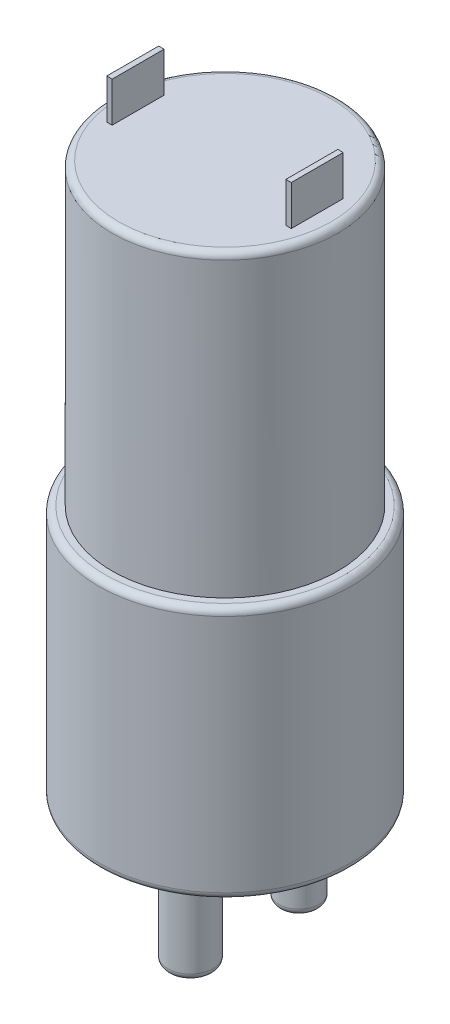
ISO-10303-21;
HEADER;
FILE_DESCRIPTION(('STEP AP214'),'2;1');
FILE_NAME('part.step','',(''),(''),'','','');
FILE_SCHEMA(('AUTOMOTIVE_DESIGN { 1 0 10303 214 1 1 1 1 }'));
ENDSEC;
DATA;
#1=APPLICATION_CONTEXT('core data for automotive mechanical design processes');
#2=APPLICATION_PROTOCOL_DEFINITION('international standard','automotive_design',2000,#1);
#3=PRODUCT_CONTEXT('',#1,'mechanical');
#4=PRODUCT('Part','Part','',(#3));
#5=PRODUCT_RELATED_PRODUCT_CATEGORY('part','',(#4));
#6=PRODUCT_DEFINITION_FORMATION('','',#4);
#7=PRODUCT_DEFINITION_CONTEXT('part definition',#1,'design');
#8=PRODUCT_DEFINITION('design','',#6,#7);
#9=PRODUCT_DEFINITION_SHAPE('','',#8);
#10=(LENGTH_UNIT() NAMED_UNIT(*) SI_UNIT(.MILLI.,.METRE.));
#11=(NAMED_UNIT(*) PLANE_ANGLE_UNIT() SI_UNIT($,.RADIAN.));
#12=(NAMED_UNIT(*) SI_UNIT($,.STERADIAN.) SOLID_ANGLE_UNIT());
#13=UNCERTAINTY_MEASURE_WITH_UNIT(LENGTH_MEASURE(1.E-05),#10,'distance_accuracy_value','');
#14=(GEOMETRIC_REPRESENTATION_CONTEXT(3) GLOBAL_UNCERTAINTY_ASSIGNED_CONTEXT((#13)) GLOBAL_UNIT_ASSIGNED_CONTEXT((#10,
#11,#12)) REPRESENTATION_CONTEXT('',''));
#15=CARTESIAN_POINT('',(0.,0.,0.));
#16=DIRECTION('',(0.,0.,1.));
#17=DIRECTION('',(1.,0.,0.));
#18=AXIS2_PLACEMENT_3D('',#15,#16,#17);
#19=CARTESIAN_POINT('',(0.,22.5,0.));
#20=DIRECTION('',(0.,1.,0.));
#21=DIRECTION('',(0.,0.,1.));
#22=AXIS2_PLACEMENT_3D('',#19,#20,#21);
#23=PLANE('',#22);
#24=CARTESIAN_POINT('',(0.,22.5,0.));
#25=DIRECTION('',(0.,1.,0.));
#26=DIRECTION('',(0.,0.,1.));
#27=AXIS2_PLACEMENT_3D('',#24,#25,#26);
#28=CIRCLE('',#27,8.);
#29=CARTESIAN_POINT('',(0.,22.5,8.));
#30=VERTEX_POINT('',#29);
#31=EDGE_CURVE('E48',#30,#30,#28,.T.);
#32=ORIENTED_EDGE('',*,*,#31,.T.);
#33=EDGE_LOOP('',(#32));
#34=FACE_BOUND('',#33,.T.);
#35=DIRECTION('',(-1.,0.,0.));
#36=VECTOR('',#35,1.);
#37=CARTESIAN_POINT('',(-6.93882099547602,22.5,-1.95345107203532));
#38=LINE('',#37,#36);
#39=CARTESIAN_POINT('',(-6.53185202211751,22.5,-1.95345107203532));
#40=VERTEX_POINT('',#39);
#41=CARTESIAN_POINT('',(-6.93882099547602,22.5,-1.95345107203532));
#42=VERTEX_POINT('',#41);
#43=EDGE_CURVE('E130',#40,#42,#38,.T.);
#44=ORIENTED_EDGE('',*,*,#43,.F.);
#45=DIRECTION('',(0.,0.,-1.));
#46=VECTOR('',#45,1.);
#47=CARTESIAN_POINT('',(-6.53185202211751,22.5,1.95345107203532));
#48=LINE('',#47,#46);
#49=CARTESIAN_POINT('',(-6.53185202211751,22.5,1.95345107203532));
#50=VERTEX_POINT('',#49);
#51=EDGE_CURVE('E127',#50,#40,#48,.T.);
#52=ORIENTED_EDGE('',*,*,#51,.F.);
#53=DIRECTION('',(1.,0.,0.));
#54=VECTOR('',#53,1.);
#55=CARTESIAN_POINT('',(-6.93882099547602,22.5,1.95345107203532));
#56=LINE('',#55,#54);
#57=CARTESIAN_POINT('',(-6.93882099547602,22.5,1.95345107203532));
#58=VERTEX_POINT('',#57);
#59=EDGE_CURVE('E145',#58,#50,#56,.T.);
#60=ORIENTED_EDGE('',*,*,#59,.F.);
#61=DIRECTION('',(0.,0.,1.));
#62=VECTOR('',#61,1.);
#63=CARTESIAN_POINT('',(-6.93882099547602,22.5,1.95345107203532));
#64=LINE('',#63,#62);
#65=EDGE_CURVE('E153',#42,#58,#64,.T.);
#66=ORIENTED_EDGE('',*,*,#65,.F.);
#67=EDGE_LOOP('',(#44,#52,#60,#66));
#68=FACE_BOUND('',#67,.T.);
#69=DIRECTION('',(-1.,0.,0.));
#70=VECTOR('',#69,1.);
#71=CARTESIAN_POINT('',(6.93882099547602,22.5,-1.95345107203532));
#72=LINE('',#71,#70);
#73=CARTESIAN_POINT('',(6.93882099547602,22.5,-1.95345107203532));
#74=VERTEX_POINT('',#73);
#75=CARTESIAN_POINT('',(6.53185202211751,22.5,-1.95345107203532));
#76=VERTEX_POINT('',#75);
#77=EDGE_CURVE('E126',#74,#76,#72,.T.);
#78=ORIENTED_EDGE('',*,*,#77,.F.);
#79=DIRECTION('',(0.,0.,-1.));
#80=VECTOR('',#79,1.);
#81=CARTESIAN_POINT('',(6.93882099547602,22.5,1.95345107203532));
#82=LINE('',#81,#80);
#83=CARTESIAN_POINT('',(6.93882099547602,22.5,1.95345107203532));
#84=VERTEX_POINT('',#83);
#85=EDGE_CURVE('E121',#84,#74,#82,.T.);
#86=ORIENTED_EDGE('',*,*,#85,.F.);
#87=DIRECTION('',(1.,0.,0.));
#88=VECTOR('',#87,1.);
#89=CARTESIAN_POINT('',(6.93882099547602,22.5,1.95345107203532));
#90=LINE('',#89,#88);
#91=CARTESIAN_POINT('',(6.53185202211751,22.5,1.95345107203532));
#92=VERTEX_POINT('',#91);
#93=EDGE_CURVE('E106',#92,#84,#90,.T.);
#94=ORIENTED_EDGE('',*,*,#93,.F.);
#95=DIRECTION('',(0.,0.,1.));
#96=VECTOR('',#95,1.);
#97=CARTESIAN_POINT('',(6.53185202211751,22.5,1.95345107203532));
#98=LINE('',#97,#96);
#99=EDGE_CURVE('E114',#76,#92,#98,.T.);
#100=ORIENTED_EDGE('',*,*,#99,.F.);
#101=EDGE_LOOP('',(#78,#86,#94,#100));
#102=FACE_BOUND('',#101,.T.);
#103=ADVANCED_FACE('F40',(#34,#68,#102),#23,.T.);
#104=CARTESIAN_POINT('',(0.,22.5,0.));
#105=DIRECTION('',(0.,-1.,0.));
#106=DIRECTION('',(0.,0.,-1.));
#107=AXIS2_PLACEMENT_3D('',#104,#105,#106);
#108=CYLINDRICAL_SURFACE('',#107,8.5);
#109=CARTESIAN_POINT('',(0.,22.,0.));
#110=DIRECTION('',(0.,1.,0.));
#111=DIRECTION('',(0.,0.,1.));
#112=AXIS2_PLACEMENT_3D('',#109,#110,#111);
#113=CIRCLE('',#112,8.5);
#114=CARTESIAN_POINT('',(0.,22.,-8.5));
#115=VERTEX_POINT('',#114);
#116=EDGE_CURVE('E11',#115,#115,#113,.F.);
#117=CARTESIAN_POINT('',(0.,0.,0.));
#118=DIRECTION('',(0.,1.,0.));
#119=DIRECTION('',(0.,0.,1.));
#120=AXIS2_PLACEMENT_3D('',#117,#118,#119);
#121=CIRCLE('',#120,8.5);
#122=CARTESIAN_POINT('',(0.,0.,-8.5));
#123=VERTEX_POINT('',#122);
#124=EDGE_CURVE('E171',#123,#123,#121,.T.);
#125=CARTESIAN_POINT('',(0.,22.,-8.5));
#126=CARTESIAN_POINT('',(0.,21.7708333333333,-8.5));
#127=CARTESIAN_POINT('',(0.,21.5416666666667,-8.5));
#128=CARTESIAN_POINT('',(0.,21.0833333333333,-8.5));
#129=CARTESIAN_POINT('',(0.,20.8541666666667,-8.5));
#130=CARTESIAN_POINT('',(0.,20.3958333333333,-8.5));
#131=CARTESIAN_POINT('',(0.,20.1666666666667,-8.5));
#132=CARTESIAN_POINT('',(0.,19.7083333333333,-8.5));
#133=CARTESIAN_POINT('',(0.,19.4791666666667,-8.5));
#134=CARTESIAN_POINT('',(0.,19.0208333333333,-8.5));
#135=CARTESIAN_POINT('',(0.,18.7916666666667,-8.5));
#136=CARTESIAN_POINT('',(0.,18.3333333333333,-8.5));
#137=CARTESIAN_POINT('',(0.,18.1041666666667,-8.5));
#138=CARTESIAN_POINT('',(0.,17.6458333333333,-8.5));
#139=CARTESIAN_POINT('',(0.,17.4166666666667,-8.5));
#140=CARTESIAN_POINT('',(0.,16.9583333333333,-8.5));
#141=CARTESIAN_POINT('',(0.,16.7291666666667,-8.5));
#142=CARTESIAN_POINT('',(0.,16.2708333333333,-8.5));
#143=CARTESIAN_POINT('',(0.,16.0416666666667,-8.5));
#144=CARTESIAN_POINT('',(0.,15.5833333333333,-8.5));
#145=CARTESIAN_POINT('',(0.,15.3541666666667,-8.5));
#146=CARTESIAN_POINT('',(0.,14.8958333333333,-8.5));
#147=CARTESIAN_POINT('',(0.,14.6666666666667,-8.5));
#148=CARTESIAN_POINT('',(0.,14.2083333333333,-8.5));
#149=CARTESIAN_POINT('',(0.,13.9791666666667,-8.5));
#150=CARTESIAN_POINT('',(0.,13.5208333333333,-8.5));
#151=CARTESIAN_POINT('',(0.,13.2916666666667,-8.5));
#152=CARTESIAN_POINT('',(0.,12.8333333333333,-8.5));
#153=CARTESIAN_POINT('',(0.,12.6041666666667,-8.5));
#154=CARTESIAN_POINT('',(0.,12.1458333333333,-8.5));
#155=CARTESIAN_POINT('',(0.,11.9166666666667,-8.5));
#156=CARTESIAN_POINT('',(0.,11.4583333333333,-8.5));
#157=CARTESIAN_POINT('',(0.,11.2291666666667,-8.5));
#158=CARTESIAN_POINT('',(0.,10.7708333333333,-8.5));
#159=CARTESIAN_POINT('',(0.,10.5416666666667,-8.5));
#160=CARTESIAN_POINT('',(0.,10.0833333333333,-8.5));
#161=CARTESIAN_POINT('',(0.,9.85416666666666,-8.5));
#162=CARTESIAN_POINT('',(0.,9.39583333333333,-8.5));
#163=CARTESIAN_POINT('',(0.,9.16666666666666,-8.5));
#164=CARTESIAN_POINT('',(0.,8.70833333333333,-8.5));
#165=CARTESIAN_POINT('',(0.,8.47916666666666,-8.5));
#166=CARTESIAN_POINT('',(0.,8.02083333333333,-8.5));
#167=CARTESIAN_POINT('',(0.,7.79166666666666,-8.5));
#168=CARTESIAN_POINT('',(0.,7.33333333333333,-8.5));
#169=CARTESIAN_POINT('',(0.,7.10416666666667,-8.5));
#170=CARTESIAN_POINT('',(0.,6.64583333333333,-8.5));
#171=CARTESIAN_POINT('',(0.,6.41666666666667,-8.5));
#172=CARTESIAN_POINT('',(0.,5.95833333333333,-8.5));
#173=CARTESIAN_POINT('',(0.,5.72916666666666,-8.5));
#174=CARTESIAN_POINT('',(0.,5.27083333333333,-8.5));
#175=CARTESIAN_POINT('',(0.,5.04166666666666,-8.5));
#176=CARTESIAN_POINT('',(0.,4.58333333333333,-8.5));
#177=CARTESIAN_POINT('',(0.,4.35416666666666,-8.5));
#178=CARTESIAN_POINT('',(0.,3.89583333333333,-8.5));
#179=CARTESIAN_POINT('',(0.,3.66666666666666,-8.5));
#180=CARTESIAN_POINT('',(0.,3.20833333333333,-8.5));
#181=CARTESIAN_POINT('',(0.,2.97916666666666,-8.5));
#182=CARTESIAN_POINT('',(0.,2.52083333333333,-8.5));
#183=CARTESIAN_POINT('',(0.,2.29166666666666,-8.5));
#184=CARTESIAN_POINT('',(0.,1.83333333333333,-8.5));
#185=CARTESIAN_POINT('',(0.,1.60416666666666,-8.5));
#186=CARTESIAN_POINT('',(0.,1.14583333333333,-8.5));
#187=CARTESIAN_POINT('',(0.,0.916666666666664,-8.5));
#188=CARTESIAN_POINT('',(0.,0.45833333333333,-8.5));
#189=CARTESIAN_POINT('',(0.,0.229166666666663,-8.5));
#190=CARTESIAN_POINT('',(0.,0.,-8.5));
#191=B_SPLINE_CURVE_WITH_KNOTS('',3,(#125,#126,#127,#128,#129,#130,#131,#132,#133,#134,#135,
#136,#137,#138,#139,#140,#141,#142,#143,#144,#145,#146,#147,#148,#149,#150,#151,#152,#153,#154,
#155,#156,#157,#158,#159,#160,#161,#162,#163,#164,#165,#166,#167,#168,#169,#170,#171,#172,#173,
#174,#175,#176,#177,#178,#179,#180,#181,#182,#183,#184,#185,#186,#187,#188,#189,#190),
.UNSPECIFIED.,.F.,.F.,(4,2,2,2,2,2,2,2,2,2,2,2,2,2,2,2,2,2,2,2,2,2,2,2,2,2,2,2,2,2,2,2,4),(0.,
0.687499999999997,1.375,2.0625,2.75,3.4375,4.125,4.8125,5.5,6.1875,6.875,7.5625,8.25,8.9375,
9.625,10.3125,11.,11.6875,12.375,13.0625,13.75,14.4375,15.125,15.8125,16.5,17.1875,17.875,
18.5625,19.25,19.9375,20.625,21.3125,22.),.UNSPECIFIED.);
#192=EDGE_CURVE('BSEAM229',#115,#123,#191,.T.);
#193=ORIENTED_EDGE('',*,*,#116,.T.);
#194=ORIENTED_EDGE('',*,*,#124,.T.);
#195=ORIENTED_EDGE('',*,*,#192,.T.);
#196=ORIENTED_EDGE('',*,*,#192,.F.);
#197=EDGE_LOOP('',(#193,#195,#194,#196));
#198=FACE_BOUND('',#197,.T.);
#199=ADVANCED_FACE('F229',(#198),#108,.T.);
#200=CARTESIAN_POINT('',(0.,-19.,0.));
#201=DIRECTION('',(0.,1.,0.));
#202=DIRECTION('',(0.,0.,1.));
#203=AXIS2_PLACEMENT_3D('',#200,#201,#202);
#204=CYLINDRICAL_SURFACE('',#203,9.5);
#205=CARTESIAN_POINT('',(0.,-18.5,0.));
#206=DIRECTION('',(0.,-1.,0.));
#207=DIRECTION('',(0.,0.,-1.));
#208=AXIS2_PLACEMENT_3D('',#205,#206,#207);
#209=CIRCLE('',#208,9.5);
#210=CARTESIAN_POINT('',(0.,-18.5,-9.5));
#211=VERTEX_POINT('',#210);
#212=EDGE_CURVE('E209',#211,#211,#209,.F.);
#213=ORIENTED_EDGE('',*,*,#212,.T.);
#214=EDGE_LOOP('',(#213));
#215=FACE_BOUND('',#214,.T.);
#216=CARTESIAN_POINT('',(0.,-0.5,0.));
#217=DIRECTION('',(0.,-1.,0.));
#218=DIRECTION('',(0.,0.,-1.));
#219=AXIS2_PLACEMENT_3D('',#216,#217,#218);
#220=CIRCLE('',#219,9.5);
#221=CARTESIAN_POINT('',(0.,-0.5,-9.5));
#222=VERTEX_POINT('',#221);
#223=EDGE_CURVE('E206',#222,#222,#220,.T.);
#224=ORIENTED_EDGE('',*,*,#223,.T.);
#225=EDGE_LOOP('',(#224));
#226=FACE_BOUND('',#225,.T.);
#227=ADVANCED_FACE('F234',(#215,#226),#204,.T.);
#228=CARTESIAN_POINT('',(0.,-19.,0.));
#229=DIRECTION('',(0.,-1.,0.));
#230=DIRECTION('',(0.,0.,-1.));
#231=AXIS2_PLACEMENT_3D('',#228,#229,#230);
#232=PLANE('',#231);
#233=CARTESIAN_POINT('',(0.,-19.,-5.56386529657235));
#234=DIRECTION('',(0.,-1.,0.));
#235=DIRECTION('',(0.,0.,-1.));
#236=AXIS2_PLACEMENT_3D('',#233,#234,#235);
#237=CIRCLE('',#236,2.);
#238=CARTESIAN_POINT('',(0.,-19.,-7.56386529657235));
#239=VERTEX_POINT('',#238);
#240=EDGE_CURVE('E191',#239,#239,#237,.F.);
#241=ORIENTED_EDGE('',*,*,#240,.T.);
#242=EDGE_LOOP('',(#241));
#243=FACE_BOUND('',#242,.T.);
#244=CARTESIAN_POINT('',(0.,-19.,2.6));
#245=DIRECTION('',(0.,-1.,0.));
#246=DIRECTION('',(0.,0.,-1.));
#247=AXIS2_PLACEMENT_3D('',#244,#245,#246);
#248=CIRCLE('',#247,2.2);
#249=CARTESIAN_POINT('',(0.,-19.,0.400000000000003));
#250=VERTEX_POINT('',#249);
#251=EDGE_CURVE('E188',#250,#250,#248,.F.);
#252=ORIENTED_EDGE('',*,*,#251,.T.);
#253=EDGE_LOOP('',(#252));
#254=FACE_BOUND('',#253,.T.);
#255=CARTESIAN_POINT('',(0.,-19.,0.));
#256=DIRECTION('',(0.,-1.,0.));
#257=DIRECTION('',(0.,0.,-1.));
#258=AXIS2_PLACEMENT_3D('',#255,#256,#257);
#259=CIRCLE('',#258,9.);
#260=CARTESIAN_POINT('',(0.,-19.,-9.));
#261=VERTEX_POINT('',#260);
#262=EDGE_CURVE('E185',#261,#261,#259,.T.);
#263=ORIENTED_EDGE('',*,*,#262,.T.);
#264=EDGE_LOOP('',(#263));
#265=FACE_BOUND('',#264,.T.);
#266=ADVANCED_FACE('F265',(#243,#254,#265),#232,.T.);
#267=CARTESIAN_POINT('',(0.,0.,0.));
#268=DIRECTION('',(0.,-1.,0.));
#269=DIRECTION('',(0.,0.,-1.));
#270=AXIS2_PLACEMENT_3D('',#267,#268,#269);
#271=PLANE('',#270);
#272=CARTESIAN_POINT('',(0.,0.,0.));
#273=DIRECTION('',(0.,-1.,0.));
#274=DIRECTION('',(0.,0.,-1.));
#275=AXIS2_PLACEMENT_3D('',#272,#273,#274);
#276=CIRCLE('',#275,9.);
#277=CARTESIAN_POINT('',(0.,0.,-9.));
#278=VERTEX_POINT('',#277);
#279=EDGE_CURVE('E212',#278,#278,#276,.F.);
#280=ORIENTED_EDGE('',*,*,#279,.T.);
#281=EDGE_LOOP('',(#280));
#282=FACE_BOUND('',#281,.T.);
#283=ORIENTED_EDGE('',*,*,#124,.F.);
#284=EDGE_LOOP('',(#283));
#285=FACE_BOUND('',#284,.T.);
#286=ADVANCED_FACE('F267',(#282,#285),#271,.F.);
#287=CARTESIAN_POINT('',(0.,-28.5,2.6));
#288=DIRECTION('',(0.,-1.,0.));
#289=DIRECTION('',(0.,0.,-1.));
#290=AXIS2_PLACEMENT_3D('',#287,#288,#289);
#291=PLANE('',#290);
#292=CARTESIAN_POINT('',(0.,-28.5,2.6));
#293=DIRECTION('',(0.,-1.,0.));
#294=DIRECTION('',(0.,0.,-1.));
#295=AXIS2_PLACEMENT_3D('',#292,#293,#294);
#296=CIRCLE('',#295,1.2);
#297=CARTESIAN_POINT('',(0.,-28.5,1.4));
#298=VERTEX_POINT('',#297);
#299=EDGE_CURVE('E200',#298,#298,#296,.T.);
#300=ORIENTED_EDGE('',*,*,#299,.T.);
#301=EDGE_LOOP('',(#300));
#302=FACE_BOUND('',#301,.T.);
#303=CARTESIAN_POINT('',(0.,-28.5,2.6));
#304=DIRECTION('',(0.,-1.,0.));
#305=DIRECTION('',(0.,0.,-1.));
#306=AXIS2_PLACEMENT_3D('',#303,#304,#305);
#307=CIRCLE('',#306,0.199999999999999);
#308=CARTESIAN_POINT('',(0.,-28.5,2.4));
#309=VERTEX_POINT('',#308);
#310=EDGE_CURVE('E168',#309,#309,#307,.T.);
#311=ORIENTED_EDGE('',*,*,#310,.F.);
#312=EDGE_LOOP('',(#311));
#313=FACE_BOUND('',#312,.T.);
#314=ADVANCED_FACE('F276',(#302,#313),#291,.T.);
#315=CARTESIAN_POINT('',(0.,-28.5,2.6));
#316=DIRECTION('',(0.,1.,0.));
#317=DIRECTION('',(0.,0.,1.));
#318=AXIS2_PLACEMENT_3D('',#315,#316,#317);
#319=CYLINDRICAL_SURFACE('',#318,1.7);
#320=CARTESIAN_POINT('',(0.,-19.5,2.6));
#321=DIRECTION('',(0.,-1.,0.));
#322=DIRECTION('',(0.,0.,-1.));
#323=AXIS2_PLACEMENT_3D('',#320,#321,#322);
#324=CIRCLE('',#323,1.7);
#325=CARTESIAN_POINT('',(0.,-19.5,0.900000000000003));
#326=VERTEX_POINT('',#325);
#327=EDGE_CURVE('E197',#326,#326,#324,.T.);
#328=ORIENTED_EDGE('',*,*,#327,.T.);
#329=EDGE_LOOP('',(#328));
#330=FACE_BOUND('',#329,.T.);
#331=CARTESIAN_POINT('',(0.,-28.,2.6));
#332=DIRECTION('',(0.,-1.,0.));
#333=DIRECTION('',(0.,0.,-1.));
#334=AXIS2_PLACEMENT_3D('',#331,#332,#333);
#335=CIRCLE('',#334,1.7);
#336=CARTESIAN_POINT('',(0.,-28.,0.900000000000003));
#337=VERTEX_POINT('',#336);
#338=EDGE_CURVE('E194',#337,#337,#335,.F.);
#339=ORIENTED_EDGE('',*,*,#338,.T.);
#340=EDGE_LOOP('',(#339));
#341=FACE_BOUND('',#340,.T.);
#342=ADVANCED_FACE('F296',(#330,#341),#319,.T.);
#343=CARTESIAN_POINT('',(0.,-28.5,2.6));
#344=DIRECTION('',(0.,1.,0.));
#345=DIRECTION('',(0.,0.,1.));
#346=AXIS2_PLACEMENT_3D('',#343,#344,#345);
#347=CYLINDRICAL_SURFACE('',#346,0.199999999999999);
#348=ORIENTED_EDGE('',*,*,#310,.T.);
#349=EDGE_LOOP('',(#348));
#350=FACE_BOUND('',#349,.T.);
#351=CARTESIAN_POINT('',(0.,-19.,2.6));
#352=DIRECTION('',(0.,-1.,0.));
#353=DIRECTION('',(0.,0.,-1.));
#354=AXIS2_PLACEMENT_3D('',#351,#352,#353);
#355=CIRCLE('',#354,0.199999999999999);
#356=CARTESIAN_POINT('',(0.,-19.,2.4));
#357=VERTEX_POINT('',#356);
#358=EDGE_CURVE('E167',#357,#357,#355,.T.);
#359=ORIENTED_EDGE('',*,*,#358,.F.);
#360=EDGE_LOOP('',(#359));
#361=FACE_BOUND('',#360,.T.);
#362=ADVANCED_FACE('F287',(#350,#361),#347,.F.);
#363=ORIENTED_EDGE('',*,*,#358,.T.);
#364=EDGE_LOOP('',(#363));
#365=FACE_BOUND('',#364,.T.);
#366=ADVANCED_FACE('F271',(#365),#232,.T.);
#367=CARTESIAN_POINT('',(0.,-28.5,-5.56386529657235));
#368=DIRECTION('',(0.,-1.,0.));
#369=DIRECTION('',(0.,0.,-1.));
#370=AXIS2_PLACEMENT_3D('',#367,#368,#369);
#371=PLANE('',#370);
#372=CARTESIAN_POINT('',(0.,-28.5,-5.56386529657235));
#373=DIRECTION('',(0.,-1.,0.));
#374=DIRECTION('',(0.,0.,-1.));
#375=AXIS2_PLACEMENT_3D('',#372,#373,#374);
#376=CIRCLE('',#375,1.);
#377=CARTESIAN_POINT('',(0.,-28.5,-6.56386529657235));
#378=VERTEX_POINT('',#377);
#379=EDGE_CURVE('E203',#378,#378,#376,.T.);
#380=ORIENTED_EDGE('',*,*,#379,.T.);
#381=EDGE_LOOP('',(#380));
#382=FACE_BOUND('',#381,.T.);
#383=CARTESIAN_POINT('',(0.,-28.5,-5.56386529657235));
#384=DIRECTION('',(0.,-1.,0.));
#385=DIRECTION('',(0.,0.,-1.));
#386=AXIS2_PLACEMENT_3D('',#383,#384,#385);
#387=CIRCLE('',#386,0.1);
#388=CARTESIAN_POINT('',(0.,-28.5,-5.66386529657235));
#389=VERTEX_POINT('',#388);
#390=EDGE_CURVE('E164',#389,#389,#387,.T.);
#391=ORIENTED_EDGE('',*,*,#390,.F.);
#392=EDGE_LOOP('',(#391));
#393=FACE_BOUND('',#392,.T.);
#394=ADVANCED_FACE('F286',(#382,#393),#371,.T.);
#395=CARTESIAN_POINT('',(0.,-28.5,-5.56386529657235));
#396=DIRECTION('',(0.,1.,0.));
#397=DIRECTION('',(0.,0.,1.));
#398=AXIS2_PLACEMENT_3D('',#395,#396,#397);
#399=CYLINDRICAL_SURFACE('',#398,1.5);
#400=CARTESIAN_POINT('',(0.,-19.5,-5.56386529657235));
#401=DIRECTION('',(0.,-1.,0.));
#402=DIRECTION('',(0.,0.,-1.));
#403=AXIS2_PLACEMENT_3D('',#400,#401,#402);
#404=CIRCLE('',#403,1.5);
#405=CARTESIAN_POINT('',(0.,-19.5,-7.06386529657235));
#406=VERTEX_POINT('',#405);
#407=EDGE_CURVE('E182',#406,#406,#404,.T.);
#408=ORIENTED_EDGE('',*,*,#407,.T.);
#409=EDGE_LOOP('',(#408));
#410=FACE_BOUND('',#409,.T.);
#411=CARTESIAN_POINT('',(0.,-28.,-5.56386529657235));
#412=DIRECTION('',(0.,-1.,0.));
#413=DIRECTION('',(0.,0.,-1.));
#414=AXIS2_PLACEMENT_3D('',#411,#412,#413);
#415=CIRCLE('',#414,1.5);
#416=CARTESIAN_POINT('',(0.,-28.,-7.06386529657235));
#417=VERTEX_POINT('',#416);
#418=EDGE_CURVE('E179',#417,#417,#415,.F.);
#419=ORIENTED_EDGE('',*,*,#418,.T.);
#420=EDGE_LOOP('',(#419));
#421=FACE_BOUND('',#420,.T.);
#422=ADVANCED_FACE('F293',(#410,#421),#399,.T.);
#423=CARTESIAN_POINT('',(0.,-28.5,-5.56386529657235));
#424=DIRECTION('',(0.,1.,0.));
#425=DIRECTION('',(0.,0.,1.));
#426=AXIS2_PLACEMENT_3D('',#423,#424,#425);
#427=CYLINDRICAL_SURFACE('',#426,0.1);
#428=ORIENTED_EDGE('',*,*,#390,.T.);
#429=EDGE_LOOP('',(#428));
#430=FACE_BOUND('',#429,.T.);
#431=CARTESIAN_POINT('',(0.,-19.,-5.56386529657235));
#432=DIRECTION('',(0.,-1.,0.));
#433=DIRECTION('',(0.,0.,-1.));
#434=AXIS2_PLACEMENT_3D('',#431,#432,#433);
#435=CIRCLE('',#434,0.1);
#436=CARTESIAN_POINT('',(0.,-19.,-5.66386529657235));
#437=VERTEX_POINT('',#436);
#438=EDGE_CURVE('E176',#437,#437,#435,.F.);
#439=ORIENTED_EDGE('',*,*,#438,.T.);
#440=EDGE_LOOP('',(#439));
#441=FACE_BOUND('',#440,.T.);
#442=ADVANCED_FACE('F283',(#430,#441),#427,.F.);
#443=ORIENTED_EDGE('',*,*,#438,.F.);
#444=EDGE_LOOP('',(#443));
#445=FACE_BOUND('',#444,.T.);
#446=ADVANCED_FACE('F270',(#445),#232,.T.);
#447=CARTESIAN_POINT('',(-6.53185202211751,25.5,1.95345107203532));
#448=DIRECTION('',(-1.,0.,0.));
#449=DIRECTION('',(0.,0.,1.));
#450=AXIS2_PLACEMENT_3D('',#447,#448,#449);
#451=PLANE('',#450);
#452=ORIENTED_EDGE('',*,*,#51,.T.);
#453=DIRECTION('',(0.,-1.,0.));
#454=VECTOR('',#453,1.);
#455=CARTESIAN_POINT('',(-6.53185202211751,25.5,-1.95345107203532));
#456=LINE('',#455,#454);
#457=CARTESIAN_POINT('',(-6.53185202211751,25.5,-1.95345107203532));
#458=VERTEX_POINT('',#457);
#459=EDGE_CURVE('E162',#458,#40,#456,.T.);
#460=ORIENTED_EDGE('',*,*,#459,.F.);
#461=DIRECTION('',(0.,0.,-1.));
#462=VECTOR('',#461,1.);
#463=CARTESIAN_POINT('',(-6.53185202211751,25.5,1.95345107203532));
#464=LINE('',#463,#462);
#465=CARTESIAN_POINT('',(-6.53185202211751,25.5,1.95345107203532));
#466=VERTEX_POINT('',#465);
#467=EDGE_CURVE('E141',#466,#458,#464,.T.);
#468=ORIENTED_EDGE('',*,*,#467,.F.);
#469=DIRECTION('',(0.,-1.,0.));
#470=VECTOR('',#469,1.);
#471=CARTESIAN_POINT('',(-6.53185202211751,25.5,1.95345107203532));
#472=LINE('',#471,#470);
#473=EDGE_CURVE('E150',#466,#50,#472,.T.);
#474=ORIENTED_EDGE('',*,*,#473,.T.);
#475=EDGE_LOOP('',(#452,#460,#468,#474));
#476=FACE_BOUND('',#475,.T.);
#477=ADVANCED_FACE('F282',(#476),#451,.F.);
#478=CARTESIAN_POINT('',(-6.93882099547602,25.5,-1.95345107203532));
#479=DIRECTION('',(0.,0.,1.));
#480=DIRECTION('',(1.,0.,0.));
#481=AXIS2_PLACEMENT_3D('',#478,#479,#480);
#482=PLANE('',#481);
#483=ORIENTED_EDGE('',*,*,#43,.T.);
#484=DIRECTION('',(0.,-1.,0.));
#485=VECTOR('',#484,1.);
#486=CARTESIAN_POINT('',(-6.93882099547602,25.5,-1.95345107203532));
#487=LINE('',#486,#485);
#488=CARTESIAN_POINT('',(-6.93882099547602,25.5,-1.95345107203532));
#489=VERTEX_POINT('',#488);
#490=EDGE_CURVE('E159',#489,#42,#487,.T.);
#491=ORIENTED_EDGE('',*,*,#490,.F.);
#492=DIRECTION('',(-1.,0.,0.));
#493=VECTOR('',#492,1.);
#494=CARTESIAN_POINT('',(-6.93882099547602,25.5,-1.95345107203532));
#495=LINE('',#494,#493);
#496=EDGE_CURVE('E144',#458,#489,#495,.T.);
#497=ORIENTED_EDGE('',*,*,#496,.F.);
#498=ORIENTED_EDGE('',*,*,#459,.T.);
#499=EDGE_LOOP('',(#483,#491,#497,#498));
#500=FACE_BOUND('',#499,.T.);
#501=ADVANCED_FACE('F468',(#500),#482,.F.);
#502=CARTESIAN_POINT('',(-6.93882099547602,25.5,1.95345107203532));
#503=DIRECTION('',(1.,0.,0.));
#504=DIRECTION('',(0.,0.,-1.));
#505=AXIS2_PLACEMENT_3D('',#502,#503,#504);
#506=PLANE('',#505);
#507=ORIENTED_EDGE('',*,*,#65,.T.);
#508=DIRECTION('',(0.,-1.,0.));
#509=VECTOR('',#508,1.);
#510=CARTESIAN_POINT('',(-6.93882099547602,25.5,1.95345107203532));
#511=LINE('',#510,#509);
#512=CARTESIAN_POINT('',(-6.93882099547602,25.5,1.95345107203532));
#513=VERTEX_POINT('',#512);
#514=EDGE_CURVE('E63',#513,#58,#511,.T.);
#515=ORIENTED_EDGE('',*,*,#514,.F.);
#516=DIRECTION('',(0.,0.,1.));
#517=VECTOR('',#516,1.);
#518=CARTESIAN_POINT('',(-6.93882099547602,25.5,1.95345107203532));
#519=LINE('',#518,#517);
#520=EDGE_CURVE('E147',#489,#513,#519,.T.);
#521=ORIENTED_EDGE('',*,*,#520,.F.);
#522=ORIENTED_EDGE('',*,*,#490,.T.);
#523=EDGE_LOOP('',(#507,#515,#521,#522));
#524=FACE_BOUND('',#523,.T.);
#525=ADVANCED_FACE('F459',(#524),#506,.F.);
#526=CARTESIAN_POINT('',(-6.93882099547602,25.5,1.95345107203532));
#527=DIRECTION('',(0.,0.,-1.));
#528=DIRECTION('',(-1.,0.,0.));
#529=AXIS2_PLACEMENT_3D('',#526,#527,#528);
#530=PLANE('',#529);
#531=ORIENTED_EDGE('',*,*,#59,.T.);
#532=ORIENTED_EDGE('',*,*,#473,.F.);
#533=DIRECTION('',(1.,0.,0.));
#534=VECTOR('',#533,1.);
#535=CARTESIAN_POINT('',(-6.93882099547602,25.5,1.95345107203532));
#536=LINE('',#535,#534);
#537=EDGE_CURVE('E149',#513,#466,#536,.T.);
#538=ORIENTED_EDGE('',*,*,#537,.F.);
#539=ORIENTED_EDGE('',*,*,#514,.T.);
#540=EDGE_LOOP('',(#531,#532,#538,#539));
#541=FACE_BOUND('',#540,.T.);
#542=ADVANCED_FACE('F449',(#541),#530,.F.);
#543=CARTESIAN_POINT('',(0.,25.5,0.));
#544=DIRECTION('',(0.,-1.,0.));
#545=DIRECTION('',(0.,0.,-1.));
#546=AXIS2_PLACEMENT_3D('',#543,#544,#545);
#547=PLANE('',#546);
#548=ORIENTED_EDGE('',*,*,#467,.T.);
#549=ORIENTED_EDGE('',*,*,#496,.T.);
#550=ORIENTED_EDGE('',*,*,#520,.T.);
#551=ORIENTED_EDGE('',*,*,#537,.T.);
#552=EDGE_LOOP('',(#548,#549,#550,#551));
#553=FACE_BOUND('',#552,.T.);
#554=ADVANCED_FACE('F440',(#553),#547,.F.);
#555=CARTESIAN_POINT('',(6.93882099547602,25.5,1.95345107203532));
#556=DIRECTION('',(-1.,0.,0.));
#557=DIRECTION('',(0.,0.,1.));
#558=AXIS2_PLACEMENT_3D('',#555,#556,#557);
#559=PLANE('',#558);
#560=ORIENTED_EDGE('',*,*,#85,.T.);
#561=DIRECTION('',(0.,-1.,0.));
#562=VECTOR('',#561,1.);
#563=CARTESIAN_POINT('',(6.93882099547602,25.5,-1.95345107203532));
#564=LINE('',#563,#562);
#565=CARTESIAN_POINT('',(6.93882099547602,25.5,-1.95345107203532));
#566=VERTEX_POINT('',#565);
#567=EDGE_CURVE('E596',#566,#74,#564,.T.);
#568=ORIENTED_EDGE('',*,*,#567,.F.);
#569=DIRECTION('',(0.,0.,-1.));
#570=VECTOR('',#569,1.);
#571=CARTESIAN_POINT('',(6.93882099547602,25.5,1.95345107203532));
#572=LINE('',#571,#570);
#573=CARTESIAN_POINT('',(6.93882099547602,25.5,1.95345107203532));
#574=VERTEX_POINT('',#573);
#575=EDGE_CURVE('E115',#574,#566,#572,.T.);
#576=ORIENTED_EDGE('',*,*,#575,.F.);
#577=DIRECTION('',(0.,-1.,0.));
#578=VECTOR('',#577,1.);
#579=CARTESIAN_POINT('',(6.93882099547602,25.5,1.95345107203532));
#580=LINE('',#579,#578);
#581=EDGE_CURVE('E109',#574,#84,#580,.T.);
#582=ORIENTED_EDGE('',*,*,#581,.T.);
#583=EDGE_LOOP('',(#560,#568,#576,#582));
#584=FACE_BOUND('',#583,.T.);
#585=ADVANCED_FACE('F119',(#584),#559,.F.);
#586=CARTESIAN_POINT('',(6.93882099547602,25.5,-1.95345107203532));
#587=DIRECTION('',(0.,0.,1.));
#588=DIRECTION('',(1.,0.,0.));
#589=AXIS2_PLACEMENT_3D('',#586,#587,#588);
#590=PLANE('',#589);
#591=ORIENTED_EDGE('',*,*,#77,.T.);
#592=DIRECTION('',(0.,-1.,0.));
#593=VECTOR('',#592,1.);
#594=CARTESIAN_POINT('',(6.53185202211751,25.5,-1.95345107203532));
#595=LINE('',#594,#593);
#596=CARTESIAN_POINT('',(6.53185202211751,25.5,-1.95345107203532));
#597=VERTEX_POINT('',#596);
#598=EDGE_CURVE('E594',#597,#76,#595,.T.);
#599=ORIENTED_EDGE('',*,*,#598,.F.);
#600=DIRECTION('',(-1.,0.,0.));
#601=VECTOR('',#600,1.);
#602=CARTESIAN_POINT('',(6.93882099547602,25.5,-1.95345107203532));
#603=LINE('',#602,#601);
#604=EDGE_CURVE('E138',#566,#597,#603,.T.);
#605=ORIENTED_EDGE('',*,*,#604,.F.);
#606=ORIENTED_EDGE('',*,*,#567,.T.);
#607=EDGE_LOOP('',(#591,#599,#605,#606));
#608=FACE_BOUND('',#607,.T.);
#609=ADVANCED_FACE('F421',(#608),#590,.F.);
#610=CARTESIAN_POINT('',(6.53185202211751,25.5,1.95345107203532));
#611=DIRECTION('',(1.,0.,0.));
#612=DIRECTION('',(0.,0.,-1.));
#613=AXIS2_PLACEMENT_3D('',#610,#611,#612);
#614=PLANE('',#613);
#615=ORIENTED_EDGE('',*,*,#99,.T.);
#616=DIRECTION('',(0.,-1.,0.));
#617=VECTOR('',#616,1.);
#618=CARTESIAN_POINT('',(6.53185202211751,25.5,1.95345107203532));
#619=LINE('',#618,#617);
#620=CARTESIAN_POINT('',(6.53185202211751,25.5,1.95345107203532));
#621=VERTEX_POINT('',#620);
#622=EDGE_CURVE('E55',#621,#92,#619,.T.);
#623=ORIENTED_EDGE('',*,*,#622,.F.);
#624=DIRECTION('',(0.,0.,1.));
#625=VECTOR('',#624,1.);
#626=CARTESIAN_POINT('',(6.53185202211751,25.5,1.95345107203532));
#627=LINE('',#626,#625);
#628=EDGE_CURVE('E136',#597,#621,#627,.T.);
#629=ORIENTED_EDGE('',*,*,#628,.F.);
#630=ORIENTED_EDGE('',*,*,#598,.T.);
#631=EDGE_LOOP('',(#615,#623,#629,#630));
#632=FACE_BOUND('',#631,.T.);
#633=ADVANCED_FACE('F412',(#632),#614,.F.);
#634=CARTESIAN_POINT('',(6.93882099547602,25.5,1.95345107203532));
#635=DIRECTION('',(0.,0.,-1.));
#636=DIRECTION('',(-1.,0.,0.));
#637=AXIS2_PLACEMENT_3D('',#634,#635,#636);
#638=PLANE('',#637);
#639=ORIENTED_EDGE('',*,*,#93,.T.);
#640=ORIENTED_EDGE('',*,*,#581,.F.);
#641=DIRECTION('',(1.,0.,0.));
#642=VECTOR('',#641,1.);
#643=CARTESIAN_POINT('',(6.93882099547602,25.5,1.95345107203532));
#644=LINE('',#643,#642);
#645=EDGE_CURVE('E124',#621,#574,#644,.T.);
#646=ORIENTED_EDGE('',*,*,#645,.F.);
#647=ORIENTED_EDGE('',*,*,#622,.T.);
#648=EDGE_LOOP('',(#639,#640,#646,#647));
#649=FACE_BOUND('',#648,.T.);
#650=ADVANCED_FACE('F108',(#649),#638,.F.);
#651=CARTESIAN_POINT('',(0.,25.5,0.));
#652=DIRECTION('',(0.,1.,0.));
#653=DIRECTION('',(0.,0.,1.));
#654=AXIS2_PLACEMENT_3D('',#651,#652,#653);
#655=PLANE('',#654);
#656=ORIENTED_EDGE('',*,*,#575,.T.);
#657=ORIENTED_EDGE('',*,*,#604,.T.);
#658=ORIENTED_EDGE('',*,*,#628,.T.);
#659=ORIENTED_EDGE('',*,*,#645,.T.);
#660=EDGE_LOOP('',(#656,#657,#658,#659));
#661=FACE_BOUND('',#660,.T.);
#662=ADVANCED_FACE('F244',(#661),#655,.T.);
#663=CARTESIAN_POINT('',(0.,-19.5,-5.56386529657235));
#664=DIRECTION('',(0.,-1.,0.));
#665=DIRECTION('',(0.,0.,-1.));
#666=AXIS2_PLACEMENT_3D('',#663,#664,#665);
#667=TOROIDAL_SURFACE('',#666,2.,0.5);
#668=ORIENTED_EDGE('',*,*,#240,.F.);
#669=EDGE_LOOP('',(#668));
#670=FACE_BOUND('',#669,.T.);
#671=ORIENTED_EDGE('',*,*,#407,.F.);
#672=EDGE_LOOP('',(#671));
#673=FACE_BOUND('',#672,.T.);
#674=ADVANCED_FACE('F240',(#670,#673),#667,.F.);
#675=CARTESIAN_POINT('',(0.,-19.5,2.6));
#676=DIRECTION('',(0.,-1.,0.));
#677=DIRECTION('',(0.,0.,-1.));
#678=AXIS2_PLACEMENT_3D('',#675,#676,#677);
#679=TOROIDAL_SURFACE('',#678,2.2,0.5);
#680=ORIENTED_EDGE('',*,*,#251,.F.);
#681=EDGE_LOOP('',(#680));
#682=FACE_BOUND('',#681,.T.);
#683=ORIENTED_EDGE('',*,*,#327,.F.);
#684=EDGE_LOOP('',(#683));
#685=FACE_BOUND('',#684,.T.);
#686=ADVANCED_FACE('F243',(#682,#685),#679,.F.);
#687=CARTESIAN_POINT('',(0.,-28.,2.6));
#688=DIRECTION('',(0.,-1.,0.));
#689=DIRECTION('',(0.,0.,-1.));
#690=AXIS2_PLACEMENT_3D('',#687,#688,#689);
#691=TOROIDAL_SURFACE('',#690,1.2,0.5);
#692=ORIENTED_EDGE('',*,*,#338,.F.);
#693=EDGE_LOOP('',(#692));
#694=FACE_BOUND('',#693,.T.);
#695=ORIENTED_EDGE('',*,*,#299,.F.);
#696=EDGE_LOOP('',(#695));
#697=FACE_BOUND('',#696,.T.);
#698=ADVANCED_FACE('F248',(#694,#697),#691,.T.);
#699=CARTESIAN_POINT('',(0.,-28.,-5.56386529657235));
#700=DIRECTION('',(0.,-1.,0.));
#701=DIRECTION('',(0.,0.,-1.));
#702=AXIS2_PLACEMENT_3D('',#699,#700,#701);
#703=TOROIDAL_SURFACE('',#702,1.,0.5);
#704=ORIENTED_EDGE('',*,*,#418,.F.);
#705=EDGE_LOOP('',(#704));
#706=FACE_BOUND('',#705,.T.);
#707=ORIENTED_EDGE('',*,*,#379,.F.);
#708=EDGE_LOOP('',(#707));
#709=FACE_BOUND('',#708,.T.);
#710=ADVANCED_FACE('F252',(#706,#709),#703,.T.);
#711=CARTESIAN_POINT('',(0.,-18.5,0.));
#712=DIRECTION('',(0.,-1.,0.));
#713=DIRECTION('',(0.,0.,-1.));
#714=AXIS2_PLACEMENT_3D('',#711,#712,#713);
#715=TOROIDAL_SURFACE('',#714,9.,0.5);
#716=ORIENTED_EDGE('',*,*,#212,.F.);
#717=EDGE_LOOP('',(#716));
#718=FACE_BOUND('',#717,.T.);
#719=ORIENTED_EDGE('',*,*,#262,.F.);
#720=EDGE_LOOP('',(#719));
#721=FACE_BOUND('',#720,.T.);
#722=ADVANCED_FACE('F225',(#718,#721),#715,.T.);
#723=CARTESIAN_POINT('',(0.,-0.5,0.));
#724=DIRECTION('',(0.,-1.,0.));
#725=DIRECTION('',(0.,0.,-1.));
#726=AXIS2_PLACEMENT_3D('',#723,#724,#725);
#727=TOROIDAL_SURFACE('',#726,9.,0.5);
#728=ORIENTED_EDGE('',*,*,#279,.F.);
#729=EDGE_LOOP('',(#728));
#730=FACE_BOUND('',#729,.T.);
#731=ORIENTED_EDGE('',*,*,#223,.F.);
#732=EDGE_LOOP('',(#731));
#733=FACE_BOUND('',#732,.T.);
#734=ADVANCED_FACE('F220',(#730,#733),#727,.T.);
#735=CARTESIAN_POINT('',(0.,22.,0.));
#736=DIRECTION('',(0.,1.,0.));
#737=DIRECTION('',(0.,0.,1.));
#738=AXIS2_PLACEMENT_3D('',#735,#736,#737);
#739=TOROIDAL_SURFACE('',#738,8.,0.5);
#740=ORIENTED_EDGE('',*,*,#116,.F.);
#741=EDGE_LOOP('',(#740));
#742=FACE_BOUND('',#741,.T.);
#743=ORIENTED_EDGE('',*,*,#31,.F.);
#744=EDGE_LOOP('',(#743));
#745=FACE_BOUND('',#744,.T.);
#746=ADVANCED_FACE('F42',(#742,#745),#739,.T.);
#747=CLOSED_SHELL('',(#103,#199,#227,#266,#286,#314,#342,#362,#366,#394,#422,#442,#446,#477,
#501,#525,#542,#554,#585,#609,#633,#650,#662,#674,#686,#698,#710,#722,#734,#746));
#748=MANIFOLD_SOLID_BREP('B2',#747);
#749=ADVANCED_BREP_SHAPE_REPRESENTATION('',(#18,#748),#14);
#750=SHAPE_DEFINITION_REPRESENTATION(#9,#749);
ENDSEC;
END-ISO-10303-21;
